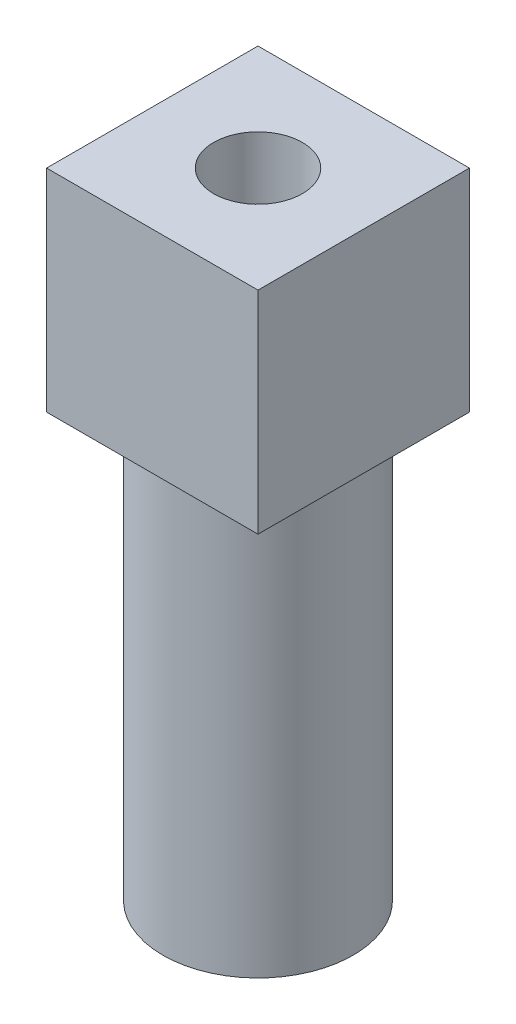
ISO-10303-21;
HEADER;
FILE_DESCRIPTION(('STEP AP214'),'2;1');
FILE_NAME('part.step','',(''),(''),'','','');
FILE_SCHEMA(('AUTOMOTIVE_DESIGN { 1 0 10303 214 1 1 1 1 }'));
ENDSEC;
DATA;
#1=APPLICATION_CONTEXT('core data for automotive mechanical design processes');
#2=APPLICATION_PROTOCOL_DEFINITION('international standard','automotive_design',2000,#1);
#3=PRODUCT_CONTEXT('',#1,'mechanical');
#4=PRODUCT('Part','Part','',(#3));
#5=PRODUCT_RELATED_PRODUCT_CATEGORY('part','',(#4));
#6=PRODUCT_DEFINITION_FORMATION('','',#4);
#7=PRODUCT_DEFINITION_CONTEXT('part definition',#1,'design');
#8=PRODUCT_DEFINITION('design','',#6,#7);
#9=PRODUCT_DEFINITION_SHAPE('','',#8);
#10=(LENGTH_UNIT() NAMED_UNIT(*) SI_UNIT(.MILLI.,.METRE.));
#11=(NAMED_UNIT(*) PLANE_ANGLE_UNIT() SI_UNIT($,.RADIAN.));
#12=(NAMED_UNIT(*) SI_UNIT($,.STERADIAN.) SOLID_ANGLE_UNIT());
#13=UNCERTAINTY_MEASURE_WITH_UNIT(LENGTH_MEASURE(1.E-05),#10,'distance_accuracy_value','');
#14=(GEOMETRIC_REPRESENTATION_CONTEXT(3) GLOBAL_UNCERTAINTY_ASSIGNED_CONTEXT((#13)) GLOBAL_UNIT_ASSIGNED_CONTEXT((#10,
#11,#12)) REPRESENTATION_CONTEXT('',''));
#15=CARTESIAN_POINT('',(0.,0.,0.));
#16=DIRECTION('',(0.,0.,1.));
#17=DIRECTION('',(1.,0.,0.));
#18=AXIS2_PLACEMENT_3D('',#15,#16,#17);
#19=CARTESIAN_POINT('',(0.,0.,0.));
#20=DIRECTION('',(0.,-1.,0.));
#21=DIRECTION('',(0.,0.,-1.));
#22=AXIS2_PLACEMENT_3D('',#19,#20,#21);
#23=PLANE('',#22);
#24=CARTESIAN_POINT('',(0.,0.,0.));
#25=DIRECTION('',(0.,1.,0.));
#26=DIRECTION('',(0.,0.,1.));
#27=AXIS2_PLACEMENT_3D('',#24,#25,#26);
#28=CIRCLE('',#27,2.09999999999999);
#29=CARTESIAN_POINT('',(0.,0.,2.09999999999999));
#30=VERTEX_POINT('',#29);
#31=EDGE_CURVE('E104',#30,#30,#28,.T.);
#32=ORIENTED_EDGE('',*,*,#31,.T.);
#33=EDGE_LOOP('',(#32));
#34=FACE_BOUND('',#33,.T.);
#35=CARTESIAN_POINT('',(0.,0.,0.));
#36=DIRECTION('',(0.,-1.,0.));
#37=DIRECTION('',(0.,0.,-1.));
#38=AXIS2_PLACEMENT_3D('',#35,#36,#37);
#39=CIRCLE('',#38,4.5);
#40=CARTESIAN_POINT('',(0.,0.,-4.5));
#41=VERTEX_POINT('',#40);
#42=EDGE_CURVE('E11',#41,#41,#39,.T.);
#43=ORIENTED_EDGE('',*,*,#42,.T.);
#44=EDGE_LOOP('',(#43));
#45=FACE_BOUND('',#44,.T.);
#46=ADVANCED_FACE('F34',(#34,#45),#23,.T.);
#47=CARTESIAN_POINT('',(0.,-2.45930268585909,0.));
#48=DIRECTION('',(0.,-1.,0.));
#49=DIRECTION('',(0.,0.,-1.));
#50=AXIS2_PLACEMENT_3D('',#47,#48,#49);
#51=CYLINDRICAL_SURFACE('',#50,4.5);
#52=CARTESIAN_POINT('',(0.,20.,0.));
#53=DIRECTION('',(0.,1.,0.));
#54=DIRECTION('',(0.,0.,1.));
#55=AXIS2_PLACEMENT_3D('',#52,#53,#54);
#56=CIRCLE('',#55,4.5);
#57=CARTESIAN_POINT('',(0.,20.,4.5));
#58=VERTEX_POINT('',#57);
#59=EDGE_CURVE('E42',#58,#58,#56,.F.);
#60=ORIENTED_EDGE('',*,*,#59,.T.);
#61=EDGE_LOOP('',(#60));
#62=FACE_BOUND('',#61,.T.);
#63=ORIENTED_EDGE('',*,*,#42,.F.);
#64=EDGE_LOOP('',(#63));
#65=FACE_BOUND('',#64,.T.);
#66=ADVANCED_FACE('F113',(#62,#65),#51,.T.);
#67=CARTESIAN_POINT('',(-5.,30.,-5.));
#68=DIRECTION('',(1.,0.,0.));
#69=DIRECTION('',(0.,0.,-1.));
#70=AXIS2_PLACEMENT_3D('',#67,#68,#69);
#71=PLANE('',#70);
#72=DIRECTION('',(0.,0.,1.));
#73=VECTOR('',#72,1.);
#74=CARTESIAN_POINT('',(-5.,20.,-5.));
#75=LINE('',#74,#73);
#76=CARTESIAN_POINT('',(-5.,20.,-5.));
#77=VERTEX_POINT('',#76);
#78=CARTESIAN_POINT('',(-5.,20.,5.));
#79=VERTEX_POINT('',#78);
#80=EDGE_CURVE('E101',#77,#79,#75,.T.);
#81=ORIENTED_EDGE('',*,*,#80,.T.);
#82=DIRECTION('',(0.,-1.,0.));
#83=VECTOR('',#82,1.);
#84=CARTESIAN_POINT('',(-5.,30.,5.));
#85=LINE('',#84,#83);
#86=CARTESIAN_POINT('',(-5.,30.,5.));
#87=VERTEX_POINT('',#86);
#88=EDGE_CURVE('E92',#87,#79,#85,.T.);
#89=ORIENTED_EDGE('',*,*,#88,.F.);
#90=DIRECTION('',(0.,0.,1.));
#91=VECTOR('',#90,1.);
#92=CARTESIAN_POINT('',(-5.,30.,-5.));
#93=LINE('',#92,#91);
#94=CARTESIAN_POINT('',(-5.,30.,-5.));
#95=VERTEX_POINT('',#94);
#96=EDGE_CURVE('E86',#95,#87,#93,.T.);
#97=ORIENTED_EDGE('',*,*,#96,.F.);
#98=DIRECTION('',(0.,-1.,0.));
#99=VECTOR('',#98,1.);
#100=CARTESIAN_POINT('',(-5.,30.,-5.));
#101=LINE('',#100,#99);
#102=EDGE_CURVE('E97',#95,#77,#101,.T.);
#103=ORIENTED_EDGE('',*,*,#102,.T.);
#104=EDGE_LOOP('',(#81,#89,#97,#103));
#105=FACE_BOUND('',#104,.T.);
#106=ADVANCED_FACE('F123',(#105),#71,.F.);
#107=CARTESIAN_POINT('',(-5.,30.,5.));
#108=DIRECTION('',(0.,0.,-1.));
#109=DIRECTION('',(-1.,0.,0.));
#110=AXIS2_PLACEMENT_3D('',#107,#108,#109);
#111=PLANE('',#110);
#112=DIRECTION('',(1.,0.,0.));
#113=VECTOR('',#112,1.);
#114=CARTESIAN_POINT('',(-5.,20.,5.));
#115=LINE('',#114,#113);
#116=CARTESIAN_POINT('',(5.,20.,5.));
#117=VERTEX_POINT('',#116);
#118=EDGE_CURVE('E91',#79,#117,#115,.T.);
#119=ORIENTED_EDGE('',*,*,#118,.T.);
#120=DIRECTION('',(0.,-1.,0.));
#121=VECTOR('',#120,1.);
#122=CARTESIAN_POINT('',(5.,30.,5.));
#123=LINE('',#122,#121);
#124=CARTESIAN_POINT('',(5.,30.,5.));
#125=VERTEX_POINT('',#124);
#126=EDGE_CURVE('E89',#125,#117,#123,.T.);
#127=ORIENTED_EDGE('',*,*,#126,.F.);
#128=DIRECTION('',(1.,0.,0.));
#129=VECTOR('',#128,1.);
#130=CARTESIAN_POINT('',(-5.,30.,5.));
#131=LINE('',#130,#129);
#132=EDGE_CURVE('E81',#87,#125,#131,.T.);
#133=ORIENTED_EDGE('',*,*,#132,.F.);
#134=ORIENTED_EDGE('',*,*,#88,.T.);
#135=EDGE_LOOP('',(#119,#127,#133,#134));
#136=FACE_BOUND('',#135,.T.);
#137=ADVANCED_FACE('F90',(#136),#111,.F.);
#138=CARTESIAN_POINT('',(5.,30.,-5.));
#139=DIRECTION('',(-1.,0.,0.));
#140=DIRECTION('',(0.,0.,1.));
#141=AXIS2_PLACEMENT_3D('',#138,#139,#140);
#142=PLANE('',#141);
#143=DIRECTION('',(0.,0.,-1.));
#144=VECTOR('',#143,1.);
#145=CARTESIAN_POINT('',(5.,20.,-5.));
#146=LINE('',#145,#144);
#147=CARTESIAN_POINT('',(5.,20.,-5.));
#148=VERTEX_POINT('',#147);
#149=EDGE_CURVE('E67',#117,#148,#146,.T.);
#150=ORIENTED_EDGE('',*,*,#149,.T.);
#151=DIRECTION('',(0.,-1.,0.));
#152=VECTOR('',#151,1.);
#153=CARTESIAN_POINT('',(5.,30.,-5.));
#154=LINE('',#153,#152);
#155=CARTESIAN_POINT('',(5.,30.,-5.));
#156=VERTEX_POINT('',#155);
#157=EDGE_CURVE('E93',#156,#148,#154,.T.);
#158=ORIENTED_EDGE('',*,*,#157,.F.);
#159=DIRECTION('',(0.,0.,-1.));
#160=VECTOR('',#159,1.);
#161=CARTESIAN_POINT('',(5.,30.,-5.));
#162=LINE('',#161,#160);
#163=EDGE_CURVE('E84',#125,#156,#162,.T.);
#164=ORIENTED_EDGE('',*,*,#163,.F.);
#165=ORIENTED_EDGE('',*,*,#126,.T.);
#166=EDGE_LOOP('',(#150,#158,#164,#165));
#167=FACE_BOUND('',#166,.T.);
#168=ADVANCED_FACE('F95',(#167),#142,.F.);
#169=CARTESIAN_POINT('',(-5.,30.,-5.));
#170=DIRECTION('',(0.,0.,1.));
#171=DIRECTION('',(1.,0.,0.));
#172=AXIS2_PLACEMENT_3D('',#169,#170,#171);
#173=PLANE('',#172);
#174=DIRECTION('',(-1.,0.,0.));
#175=VECTOR('',#174,1.);
#176=CARTESIAN_POINT('',(-5.,20.,-5.));
#177=LINE('',#176,#175);
#178=EDGE_CURVE('E73',#148,#77,#177,.T.);
#179=ORIENTED_EDGE('',*,*,#178,.T.);
#180=ORIENTED_EDGE('',*,*,#102,.F.);
#181=DIRECTION('',(-1.,0.,0.));
#182=VECTOR('',#181,1.);
#183=CARTESIAN_POINT('',(-5.,30.,-5.));
#184=LINE('',#183,#182);
#185=EDGE_CURVE('E50',#156,#95,#184,.T.);
#186=ORIENTED_EDGE('',*,*,#185,.F.);
#187=ORIENTED_EDGE('',*,*,#157,.T.);
#188=EDGE_LOOP('',(#179,#180,#186,#187));
#189=FACE_BOUND('',#188,.T.);
#190=ADVANCED_FACE('F124',(#189),#173,.F.);
#191=CARTESIAN_POINT('',(0.,30.,0.));
#192=DIRECTION('',(0.,1.,0.));
#193=DIRECTION('',(0.,0.,1.));
#194=AXIS2_PLACEMENT_3D('',#191,#192,#193);
#195=PLANE('',#194);
#196=CARTESIAN_POINT('',(0.,30.,0.));
#197=DIRECTION('',(0.,1.,0.));
#198=DIRECTION('',(0.,0.,1.));
#199=AXIS2_PLACEMENT_3D('',#196,#197,#198);
#200=CIRCLE('',#199,2.09999999999999);
#201=CARTESIAN_POINT('',(0.,30.,2.09999999999999));
#202=VERTEX_POINT('',#201);
#203=EDGE_CURVE('E144',#202,#202,#200,.T.);
#204=ORIENTED_EDGE('',*,*,#203,.F.);
#205=EDGE_LOOP('',(#204));
#206=FACE_BOUND('',#205,.T.);
#207=ORIENTED_EDGE('',*,*,#96,.T.);
#208=ORIENTED_EDGE('',*,*,#132,.T.);
#209=ORIENTED_EDGE('',*,*,#163,.T.);
#210=ORIENTED_EDGE('',*,*,#185,.T.);
#211=EDGE_LOOP('',(#207,#208,#209,#210));
#212=FACE_BOUND('',#211,.T.);
#213=ADVANCED_FACE('F82',(#206,#212),#195,.T.);
#214=CARTESIAN_POINT('',(0.,20.,0.));
#215=DIRECTION('',(0.,1.,0.));
#216=DIRECTION('',(0.,0.,1.));
#217=AXIS2_PLACEMENT_3D('',#214,#215,#216);
#218=PLANE('',#217);
#219=ORIENTED_EDGE('',*,*,#59,.F.);
#220=EDGE_LOOP('',(#219));
#221=FACE_BOUND('',#220,.T.);
#222=ORIENTED_EDGE('',*,*,#80,.F.);
#223=ORIENTED_EDGE('',*,*,#178,.F.);
#224=ORIENTED_EDGE('',*,*,#149,.F.);
#225=ORIENTED_EDGE('',*,*,#118,.F.);
#226=EDGE_LOOP('',(#222,#223,#224,#225));
#227=FACE_BOUND('',#226,.T.);
#228=ADVANCED_FACE('F116',(#221,#227),#218,.F.);
#229=CARTESIAN_POINT('',(0.,30.,0.));
#230=DIRECTION('',(0.,1.,0.));
#231=DIRECTION('',(0.,0.,1.));
#232=AXIS2_PLACEMENT_3D('',#229,#230,#231);
#233=CYLINDRICAL_SURFACE('',#232,2.09999999999999);
#234=ORIENTED_EDGE('',*,*,#31,.F.);
#235=EDGE_LOOP('',(#234));
#236=FACE_BOUND('',#235,.T.);
#237=ORIENTED_EDGE('',*,*,#203,.T.);
#238=EDGE_LOOP('',(#237));
#239=FACE_BOUND('',#238,.T.);
#240=ADVANCED_FACE('F119',(#236,#239),#233,.F.);
#241=CLOSED_SHELL('',(#46,#66,#106,#137,#168,#190,#213,#228,#240));
#242=MANIFOLD_SOLID_BREP('B2',#241);
#243=ADVANCED_BREP_SHAPE_REPRESENTATION('',(#18,#242),#14);
#244=SHAPE_DEFINITION_REPRESENTATION(#9,#243);
ENDSEC;
END-ISO-10303-21;
